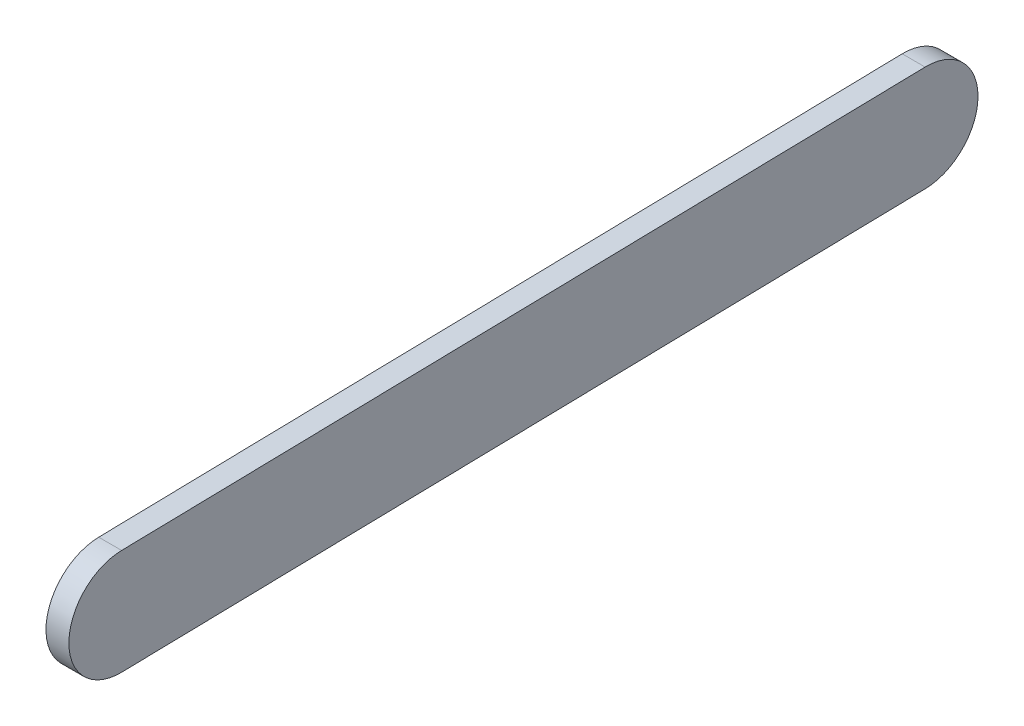
ISO-10303-21;
HEADER;
FILE_DESCRIPTION(('STEP AP214'),'2;1');
FILE_NAME('part.step','',(''),(''),'','','');
FILE_SCHEMA(('AUTOMOTIVE_DESIGN { 1 0 10303 214 1 1 1 1 }'));
ENDSEC;
DATA;
#1=APPLICATION_CONTEXT('core data for automotive mechanical design processes');
#2=APPLICATION_PROTOCOL_DEFINITION('international standard','automotive_design',2000,#1);
#3=PRODUCT_CONTEXT('',#1,'mechanical');
#4=PRODUCT('Part','Part','',(#3));
#5=PRODUCT_RELATED_PRODUCT_CATEGORY('part','',(#4));
#6=PRODUCT_DEFINITION_FORMATION('','',#4);
#7=PRODUCT_DEFINITION_CONTEXT('part definition',#1,'design');
#8=PRODUCT_DEFINITION('design','',#6,#7);
#9=PRODUCT_DEFINITION_SHAPE('','',#8);
#10=(LENGTH_UNIT() NAMED_UNIT(*) SI_UNIT(.MILLI.,.METRE.));
#11=(NAMED_UNIT(*) PLANE_ANGLE_UNIT() SI_UNIT($,.RADIAN.));
#12=(NAMED_UNIT(*) SI_UNIT($,.STERADIAN.) SOLID_ANGLE_UNIT());
#13=UNCERTAINTY_MEASURE_WITH_UNIT(LENGTH_MEASURE(1.E-05),#10,'distance_accuracy_value','');
#14=(GEOMETRIC_REPRESENTATION_CONTEXT(3) GLOBAL_UNCERTAINTY_ASSIGNED_CONTEXT((#13)) GLOBAL_UNIT_ASSIGNED_CONTEXT((#10,
#11,#12)) REPRESENTATION_CONTEXT('',''));
#15=CARTESIAN_POINT('',(0.,0.,0.));
#16=DIRECTION('',(0.,0.,1.));
#17=DIRECTION('',(1.,0.,0.));
#18=AXIS2_PLACEMENT_3D('',#15,#16,#17);
#19=CARTESIAN_POINT('',(1.48702423197996,-97.7090262823313,43.9702622404811));
#20=CARTESIAN_POINT('',(1.49187067793298,-97.7150393212282,44.4927282302285));
#21=CARTESIAN_POINT('',(1.49837869120924,-97.5205544066888,44.9782578375592));
#22=CARTESIAN_POINT('',(1.50487657336827,-97.326372249594,45.4630316140147));
#23=CARTESIAN_POINT('',(1.51205529666748,-96.9606823643731,45.8373631524524));
#24=CARTESIAN_POINT('',(1.51921893167334,-96.5957610888389,46.2109079181132));
#25=CARTESIAN_POINT('',(1.52597192041522,-96.1146451375144,46.4167878962581));
#26=CARTESIAN_POINT('',(1.53271071567579,-95.6345403992279,46.6222351543536));
#27=CARTESIAN_POINT('',(1.53800989410182,-95.1112435278365,46.6283203813914));
#28=CARTESIAN_POINT('',(1.54329793467558,-94.5890465256657,46.6343928184541));
#29=CARTESIAN_POINT('',(1.54633655527139,-94.1032355082445,46.4397568787365));
#30=CARTESIAN_POINT('',(1.54936878927196,-93.6184455720108,46.2455300262757));
#31=CARTESIAN_POINT('',(1.5496842520993,-93.2440803320025,45.8798043169564));
#32=CARTESIAN_POINT('',(1.54999905188452,-92.8705019356323,45.5148472926455));
#33=CARTESIAN_POINT('',(1.5475433308473,-92.6645758789106,45.0337099364738));
#34=CARTESIAN_POINT('',(1.5450914291121,-92.4589700921995,44.5533208773783));
#35=CARTESIAN_POINT('',(1.54023972560546,-92.452945971504,44.0302832400864));
#36=B_SPLINE_CURVE_WITH_KNOTS('',2,(#19,#20,#21,#22,#23,#24,#25,#26,#27,#28,#29,#30,#31,#32,#33,
#34,#35),.UNSPECIFIED.,.F.,.F.,(3,2,2,2,2,2,2,2,3),(0.,0.125,0.25,0.375,0.5,0.625,0.75,0.875,
1.),.UNSPECIFIED.);
#37=DIRECTION('',(-0.999905740949278,0.0100163709739956,0.00939050207319045));
#38=VECTOR('',#37,1.);
#39=SURFACE_OF_LINEAR_EXTRUSION('',#36,#38);
#40=CARTESIAN_POINT('',(0.420932566178643,-92.4417335188862,44.0407950871242));
#41=CARTESIAN_POINT('',(0.425784269685277,-92.4477576395817,44.5638327244161));
#42=CARTESIAN_POINT('',(0.428236171420484,-92.6533634262928,45.0442217835116));
#43=CARTESIAN_POINT('',(0.430691892457701,-92.8592894830145,45.5253591396834));
#44=CARTESIAN_POINT('',(0.430377092672474,-93.2328678793847,45.8903161639943));
#45=CARTESIAN_POINT('',(0.430061629845137,-93.607233119393,46.2560418733135));
#46=CARTESIAN_POINT('',(0.427029395844565,-94.0920230556267,46.4502687257743));
#47=CARTESIAN_POINT('',(0.423990775248763,-94.5778340730479,46.644904665492));
#48=CARTESIAN_POINT('',(0.418702734675,-95.1000310752187,46.6388322284292));
#49=CARTESIAN_POINT('',(0.413403556248971,-95.6233279466101,46.6327470013915));
#50=CARTESIAN_POINT('',(0.406664760988398,-96.1034326848966,46.4272997432959));
#51=CARTESIAN_POINT('',(0.399911772246518,-96.5845486362211,46.2214197651511));
#52=CARTESIAN_POINT('',(0.392748137240663,-96.9494699117553,45.8478749994903));
#53=CARTESIAN_POINT('',(0.385569413941449,-97.3151597969761,45.4735434610525));
#54=CARTESIAN_POINT('',(0.379071531782418,-97.509341954071,44.988769684597));
#55=CARTESIAN_POINT('',(0.372563518506158,-97.7038268686104,44.5032400772663));
#56=CARTESIAN_POINT('',(0.367717072553141,-97.6978138297135,43.9807740875189));
#57=B_SPLINE_CURVE_WITH_KNOTS('',2,(#40,#41,#42,#43,#44,#45,#46,#47,#48,#49,#50,#51,#52,#53,#54,
#55,#56),.UNSPECIFIED.,.F.,.F.,(3,2,2,2,2,2,2,2,3),(0.,0.125,0.25,0.375,0.5,0.625,0.75,0.875,
1.),.UNSPECIFIED.);
#58=CARTESIAN_POINT('',(0.367717072553141,-97.6978138297135,43.9807740875189));
#59=VERTEX_POINT('',#58);
#60=CARTESIAN_POINT('',(0.420932548365885,-92.4417334967528,44.0407931668036));
#61=VERTEX_POINT('',#60);
#62=EDGE_CURVE('E91',#59,#61,#57,.F.);
#63=ORIENTED_EDGE('',*,*,#62,.F.);
#64=CARTESIAN_POINT('',(0.367717072553141,-97.6978138297135,43.9807740875189));
#65=DIRECTION('',(0.999905740949278,-0.0100163709740014,-0.00939050207318749));
#66=VECTOR('',#65,1.);
#67=LINE('',#64,#66);
#68=CARTESIAN_POINT('',(1.48702423197996,-97.7090262823313,43.9702622404811));
#69=VERTEX_POINT('',#68);
#70=EDGE_CURVE('E38',#69,#59,#67,.F.);
#71=ORIENTED_EDGE('',*,*,#70,.F.);
#72=CARTESIAN_POINT('',(1.48702423197996,-97.7090262823313,43.9702622404811));
#73=CARTESIAN_POINT('',(1.49187067793298,-97.7150393212282,44.4927282302285));
#74=CARTESIAN_POINT('',(1.49837869120924,-97.5205544066888,44.9782578375592));
#75=CARTESIAN_POINT('',(1.50487657336827,-97.326372249594,45.4630316140147));
#76=CARTESIAN_POINT('',(1.51205529666748,-96.9606823643731,45.8373631524524));
#77=CARTESIAN_POINT('',(1.51921893167334,-96.5957610888389,46.2109079181132));
#78=CARTESIAN_POINT('',(1.52597192041522,-96.1146451375144,46.4167878962581));
#79=CARTESIAN_POINT('',(1.53271071567579,-95.6345403992279,46.6222351543536));
#80=CARTESIAN_POINT('',(1.53800989410182,-95.1112435278365,46.6283203813914));
#81=CARTESIAN_POINT('',(1.54329793467558,-94.5890465256657,46.6343928184541));
#82=CARTESIAN_POINT('',(1.54633655527139,-94.1032355082445,46.4397568787365));
#83=CARTESIAN_POINT('',(1.54936878927196,-93.6184455720108,46.2455300262757));
#84=CARTESIAN_POINT('',(1.5496842520993,-93.2440803320025,45.8798043169564));
#85=CARTESIAN_POINT('',(1.54999905188452,-92.8705019356323,45.5148472926455));
#86=CARTESIAN_POINT('',(1.54754333084731,-92.6645758789106,45.0337099364738));
#87=CARTESIAN_POINT('',(1.5450914291121,-92.4589700921995,44.5533208773783));
#88=CARTESIAN_POINT('',(1.54023972560546,-92.452945971504,44.0302832400864));
#89=B_SPLINE_CURVE_WITH_KNOTS('',2,(#72,#73,#74,#75,#76,#77,#78,#79,#80,#81,#82,#83,#84,#85,#86,
#87,#88),.UNSPECIFIED.,.F.,.F.,(3,2,2,2,2,2,2,2,3),(0.,0.125,0.25,0.375,0.5,0.625,0.75,0.875,
1.),.UNSPECIFIED.);
#90=CARTESIAN_POINT('',(1.54023970779271,-92.4529459493706,44.0302813197657));
#91=VERTEX_POINT('',#90);
#92=EDGE_CURVE('E76',#69,#91,#89,.T.);
#93=ORIENTED_EDGE('',*,*,#92,.T.);
#94=CARTESIAN_POINT('',(1.54023972560546,-92.452945971504,44.0302832400864));
#95=DIRECTION('',(-0.999905740949278,0.0100163709740014,0.00939050207318749));
#96=VECTOR('',#95,1.);
#97=LINE('',#94,#96);
#98=EDGE_CURVE('E10',#91,#61,#97,.T.);
#99=ORIENTED_EDGE('',*,*,#98,.T.);
#100=EDGE_LOOP('',(#63,#71,#93,#99));
#101=FACE_BOUND('',#100,.T.);
#102=ADVANCED_FACE('F16',(#101),#39,.T.);
#103=CARTESIAN_POINT('',(1.54023970779271,-92.4529459493706,44.0302813197657));
#104=DIRECTION('',(0.0101233798572447,0.999883566262585,0.0114180163899484));
#105=DIRECTION('',(0.,-0.0114186015101801,0.999934805644624));
#106=AXIS2_PLACEMENT_3D('',#103,#104,#105);
#107=PLANE('',#106);
#108=DIRECTION('',(-0.00927504161398898,0.0115120037580995,-0.999890717714957));
#109=VECTOR('',#108,1.);
#110=CARTESIAN_POINT('',(0.420932548365885,-92.4417334967528,44.0407931668036));
#111=LINE('',#110,#109);
#112=CARTESIAN_POINT('',(0.0499307966995085,-91.9812532383134,4.04515506770307));
#113=VERTEX_POINT('',#112);
#114=EDGE_CURVE('E96',#61,#113,#111,.T.);
#115=ORIENTED_EDGE('',*,*,#114,.F.);
#116=ORIENTED_EDGE('',*,*,#98,.F.);
#117=DIRECTION('',(-0.00927504161398898,0.0115120037580995,-0.999890717714957));
#118=VECTOR('',#117,1.);
#119=CARTESIAN_POINT('',(1.54023970779271,-92.4529459493706,44.0302813197657));
#120=LINE('',#119,#118);
#121=CARTESIAN_POINT('',(1.16923795612633,-91.9924656909312,4.03464322066521));
#122=VERTEX_POINT('',#121);
#123=EDGE_CURVE('E74',#91,#122,#120,.T.);
#124=ORIENTED_EDGE('',*,*,#123,.T.);
#125=DIRECTION('',(-0.999905740949278,0.0100163709739956,0.00939050207319045));
#126=VECTOR('',#125,1.);
#127=CARTESIAN_POINT('',(1.16923795612633,-91.9924656909312,4.03464322066521));
#128=LINE('',#127,#126);
#129=EDGE_CURVE('E29',#122,#113,#128,.T.);
#130=ORIENTED_EDGE('',*,*,#129,.T.);
#131=EDGE_LOOP('',(#115,#116,#124,#130));
#132=FACE_BOUND('',#131,.T.);
#133=ADVANCED_FACE('F77',(#132),#107,.T.);
#134=CARTESIAN_POINT('',(1.14263020931332,-94.6205058463692,4.00463272086255));
#135=DIRECTION('',(-0.999905740949278,0.0100163709739956,0.00939050207319045));
#136=DIRECTION('',(-0.0100168126326601,-0.999949830473851,0.));
#137=AXIS2_PLACEMENT_3D('',#134,#135,#136);
#138=CYLINDRICAL_SURFACE('',#137,2.62834618360736);
#139=CARTESIAN_POINT('',(0.0233230498865034,-94.6092933937514,4.01514456790041));
#140=DIRECTION('',(-0.999905740949278,0.0100163709739956,0.00939050207319045));
#141=DIRECTION('',(0.0101233798572439,0.999883566262586,0.0114180163898612));
#142=AXIS2_PLACEMENT_3D('',#139,#140,#141);
#143=CIRCLE('',#142,2.62834618360736);
#144=CARTESIAN_POINT('',(-0.00328469692648399,-97.2373335491894,3.98513406809747));
#145=VERTEX_POINT('',#144);
#146=EDGE_CURVE('E71',#113,#145,#143,.T.);
#147=ORIENTED_EDGE('',*,*,#146,.F.);
#148=ORIENTED_EDGE('',*,*,#129,.F.);
#149=CARTESIAN_POINT('',(1.14263020931332,-94.6205058463692,4.00463272086255));
#150=DIRECTION('',(-0.999905740949278,0.0100163709739956,0.00939050207319045));
#151=DIRECTION('',(0.0101233798572439,0.999883566262586,0.0114180163898612));
#152=AXIS2_PLACEMENT_3D('',#149,#150,#151);
#153=CIRCLE('',#152,2.62834618360736);
#154=CARTESIAN_POINT('',(1.11602246250034,-97.2485460018072,3.97462222105962));
#155=VERTEX_POINT('',#154);
#156=EDGE_CURVE('E66',#122,#155,#153,.T.);
#157=ORIENTED_EDGE('',*,*,#156,.T.);
#158=DIRECTION('',(-0.999905740949278,0.0100163709739956,0.00939050207319045));
#159=VECTOR('',#158,1.);
#160=CARTESIAN_POINT('',(1.11602246250034,-97.2485460018072,3.97462222105962));
#161=LINE('',#160,#159);
#162=EDGE_CURVE('E52',#155,#145,#161,.T.);
#163=ORIENTED_EDGE('',*,*,#162,.T.);
#164=EDGE_LOOP('',(#147,#148,#157,#163));
#165=FACE_BOUND('',#164,.T.);
#166=ADVANCED_FACE('F69',(#165),#138,.T.);
#167=CARTESIAN_POINT('',(1.11602246250034,-97.2485460018072,3.97462222105961));
#168=DIRECTION('',(-0.0101233798572447,-0.999883566262585,-0.0114180163899484));
#169=DIRECTION('',(0.,0.0114186015101801,-0.999934805644624));
#170=AXIS2_PLACEMENT_3D('',#167,#168,#169);
#171=PLANE('',#170);
#172=DIRECTION('',(0.00927504161398898,-0.0115120037580995,0.999890717714957));
#173=VECTOR('',#172,1.);
#174=CARTESIAN_POINT('',(-0.00328469692648404,-97.2373335491894,3.98513406809747));
#175=LINE('',#174,#173);
#176=EDGE_CURVE('E157',#145,#59,#175,.T.);
#177=ORIENTED_EDGE('',*,*,#176,.F.);
#178=ORIENTED_EDGE('',*,*,#162,.F.);
#179=DIRECTION('',(0.00927504161398898,-0.0115120037580995,0.999890717714957));
#180=VECTOR('',#179,1.);
#181=CARTESIAN_POINT('',(1.11602246250034,-97.2485460018072,3.97462222105961));
#182=LINE('',#181,#180);
#183=EDGE_CURVE('E85',#155,#69,#182,.T.);
#184=ORIENTED_EDGE('',*,*,#183,.T.);
#185=ORIENTED_EDGE('',*,*,#70,.T.);
#186=EDGE_LOOP('',(#177,#178,#184,#185));
#187=FACE_BOUND('',#186,.T.);
#188=ADVANCED_FACE('F111',(#187),#171,.T.);
#189=CARTESIAN_POINT('',(1.65945358024301,-62.1261059099895,24.3761410617562));
#190=DIRECTION('',(-0.999905740949278,0.0100163709739956,0.00939050207319045));
#191=DIRECTION('',(-0.0100168126326601,-0.99994983047385,0.));
#192=AXIS2_PLACEMENT_3D('',#189,#190,#191);
#193=PLANE('',#192);
#194=ORIENTED_EDGE('',*,*,#92,.F.);
#195=ORIENTED_EDGE('',*,*,#183,.F.);
#196=ORIENTED_EDGE('',*,*,#156,.F.);
#197=ORIENTED_EDGE('',*,*,#123,.F.);
#198=EDGE_LOOP('',(#194,#195,#196,#197));
#199=FACE_BOUND('',#198,.T.);
#200=ADVANCED_FACE('F81',(#199),#193,.F.);
#201=CARTESIAN_POINT('',(0.540146420816184,-62.1148934573716,24.386652908794));
#202=DIRECTION('',(-0.999905740949278,0.0100163709739956,0.00939050207319045));
#203=DIRECTION('',(-0.0100168126326601,-0.99994983047385,0.));
#204=AXIS2_PLACEMENT_3D('',#201,#202,#203);
#205=PLANE('',#204);
#206=ORIENTED_EDGE('',*,*,#62,.T.);
#207=ORIENTED_EDGE('',*,*,#114,.T.);
#208=ORIENTED_EDGE('',*,*,#146,.T.);
#209=ORIENTED_EDGE('',*,*,#176,.T.);
#210=EDGE_LOOP('',(#206,#207,#208,#209));
#211=FACE_BOUND('',#210,.T.);
#212=ADVANCED_FACE('F97',(#211),#205,.T.);
#213=CLOSED_SHELL('',(#102,#133,#166,#188,#200,#212));
#214=MANIFOLD_SOLID_BREP('B1',#213);
#215=ADVANCED_BREP_SHAPE_REPRESENTATION('',(#18,#214),#14);
#216=SHAPE_DEFINITION_REPRESENTATION(#9,#215);
ENDSEC;
END-ISO-10303-21;
